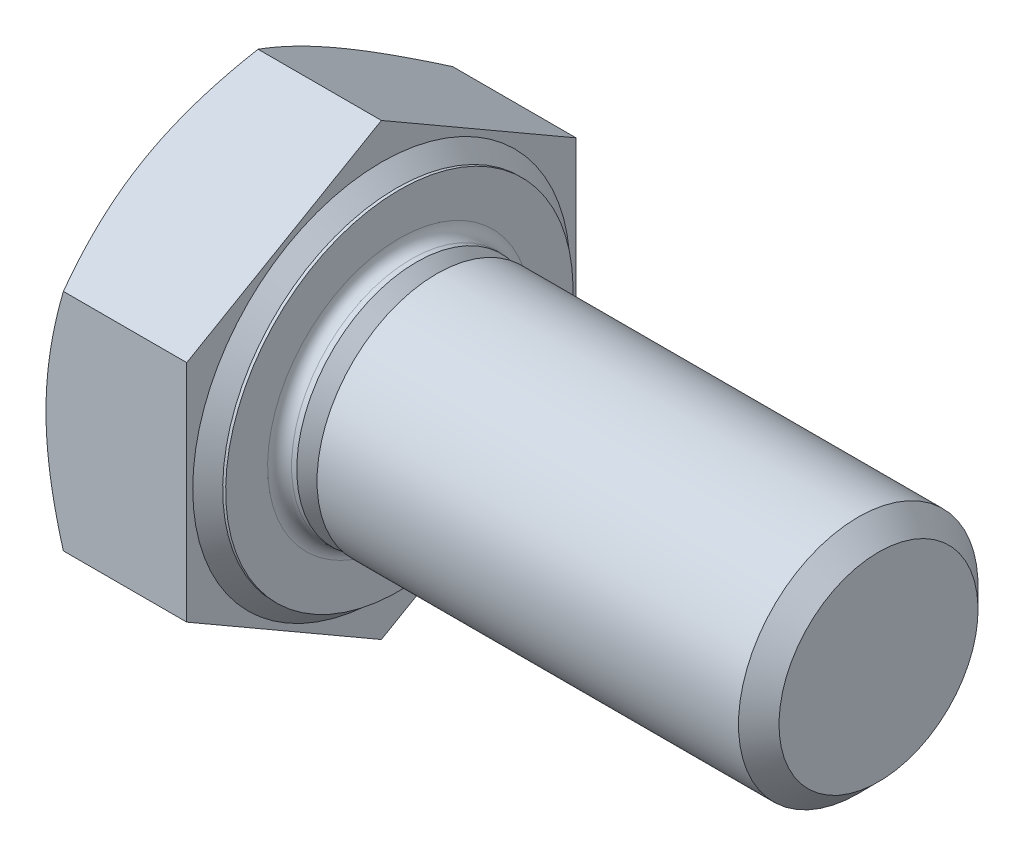
ISO-10303-21;
HEADER;
FILE_DESCRIPTION(('STEP AP214'),'2;1');
FILE_NAME('part.step','',(''),(''),'','','');
FILE_SCHEMA(('AUTOMOTIVE_DESIGN { 1 0 10303 214 1 1 1 1 }'));
ENDSEC;
DATA;
#1=APPLICATION_CONTEXT('core data for automotive mechanical design processes');
#2=APPLICATION_PROTOCOL_DEFINITION('international standard','automotive_design',2000,#1);
#3=PRODUCT_CONTEXT('',#1,'mechanical');
#4=PRODUCT('Part','Part','',(#3));
#5=PRODUCT_RELATED_PRODUCT_CATEGORY('part','',(#4));
#6=PRODUCT_DEFINITION_FORMATION('','',#4);
#7=PRODUCT_DEFINITION_CONTEXT('part definition',#1,'design');
#8=PRODUCT_DEFINITION('design','',#6,#7);
#9=PRODUCT_DEFINITION_SHAPE('','',#8);
#10=(LENGTH_UNIT() NAMED_UNIT(*) SI_UNIT(.MILLI.,.METRE.));
#11=(NAMED_UNIT(*) PLANE_ANGLE_UNIT() SI_UNIT($,.RADIAN.));
#12=(NAMED_UNIT(*) SI_UNIT($,.STERADIAN.) SOLID_ANGLE_UNIT());
#13=UNCERTAINTY_MEASURE_WITH_UNIT(LENGTH_MEASURE(1.E-05),#10,'distance_accuracy_value','');
#14=(GEOMETRIC_REPRESENTATION_CONTEXT(3) GLOBAL_UNCERTAINTY_ASSIGNED_CONTEXT((#13)) GLOBAL_UNIT_ASSIGNED_CONTEXT((#10,
#11,#12)) REPRESENTATION_CONTEXT('',''));
#15=CARTESIAN_POINT('',(0.,0.,0.));
#16=DIRECTION('',(0.,0.,1.));
#17=DIRECTION('',(1.,0.,0.));
#18=AXIS2_PLACEMENT_3D('',#15,#16,#17);
#19=CARTESIAN_POINT('',(0.,0.,0.));
#20=DIRECTION('',(-1.,0.,0.));
#21=DIRECTION('',(0.,0.,1.));
#22=AXIS2_PLACEMENT_3D('',#19,#20,#21);
#23=PLANE('',#22);
#24=DIRECTION('',(0.,-0.5,-0.866025403784439));
#25=VECTOR('',#24,1.);
#26=CARTESIAN_POINT('',(0.,7.50555349946513,0.));
#27=LINE('',#26,#25);
#28=CARTESIAN_POINT('',(0.,7.50555349946513,0.));
#29=VERTEX_POINT('',#28);
#30=CARTESIAN_POINT('',(0.,3.75277674973257,-6.5));
#31=VERTEX_POINT('',#30);
#32=EDGE_CURVE('E12',#29,#31,#27,.T.);
#33=ORIENTED_EDGE('',*,*,#32,.F.);
#34=DIRECTION('',(0.,0.5,-0.866025403784439));
#35=VECTOR('',#34,1.);
#36=CARTESIAN_POINT('',(0.,3.75277674973256,6.5));
#37=LINE('',#36,#35);
#38=CARTESIAN_POINT('',(0.,3.75277674973256,6.5));
#39=VERTEX_POINT('',#38);
#40=EDGE_CURVE('E213',#39,#29,#37,.T.);
#41=ORIENTED_EDGE('',*,*,#40,.F.);
#42=DIRECTION('',(0.,1.,0.));
#43=VECTOR('',#42,1.);
#44=CARTESIAN_POINT('',(0.,-3.75277674973257,6.5));
#45=LINE('',#44,#43);
#46=CARTESIAN_POINT('',(0.,-3.75277674973257,6.5));
#47=VERTEX_POINT('',#46);
#48=EDGE_CURVE('E29',#47,#39,#45,.T.);
#49=ORIENTED_EDGE('',*,*,#48,.F.);
#50=DIRECTION('',(0.,0.5,0.866025403784439));
#51=VECTOR('',#50,1.);
#52=CARTESIAN_POINT('',(0.,-7.50555349946513,0.));
#53=LINE('',#52,#51);
#54=CARTESIAN_POINT('',(0.,-7.50555349946513,0.));
#55=VERTEX_POINT('',#54);
#56=EDGE_CURVE('E299',#55,#47,#53,.T.);
#57=ORIENTED_EDGE('',*,*,#56,.F.);
#58=DIRECTION('',(0.,-0.5,0.866025403784439));
#59=VECTOR('',#58,1.);
#60=CARTESIAN_POINT('',(0.,-3.75277674973256,-6.5));
#61=LINE('',#60,#59);
#62=CARTESIAN_POINT('',(0.,-3.75277674973256,-6.5));
#63=VERTEX_POINT('',#62);
#64=EDGE_CURVE('E221',#63,#55,#61,.T.);
#65=ORIENTED_EDGE('',*,*,#64,.F.);
#66=DIRECTION('',(0.,-1.,0.));
#67=VECTOR('',#66,1.);
#68=CARTESIAN_POINT('',(0.,3.75277674973257,-6.5));
#69=LINE('',#68,#67);
#70=EDGE_CURVE('E286',#31,#63,#69,.T.);
#71=ORIENTED_EDGE('',*,*,#70,.F.);
#72=EDGE_LOOP('',(#33,#41,#49,#57,#65,#71));
#73=FACE_BOUND('',#72,.T.);
#74=CARTESIAN_POINT('',(0.,0.,0.));
#75=DIRECTION('',(-1.,0.,0.));
#76=DIRECTION('',(0.,1.,0.));
#77=AXIS2_PLACEMENT_3D('',#74,#75,#76);
#78=CIRCLE('',#77,6.3);
#79=CARTESIAN_POINT('',(0.,6.3,0.));
#80=VERTEX_POINT('',#79);
#81=EDGE_CURVE('E246',#80,#80,#78,.T.);
#82=ORIENTED_EDGE('',*,*,#81,.T.);
#83=EDGE_LOOP('',(#82));
#84=FACE_BOUND('',#83,.T.);
#85=ADVANCED_FACE('F18',(#73,#84),#23,.F.);
#86=CARTESIAN_POINT('',(-4.7,0.,0.));
#87=DIRECTION('',(-1.,0.,0.));
#88=DIRECTION('',(0.,0.,1.));
#89=AXIS2_PLACEMENT_3D('',#86,#87,#88);
#90=PLANE('',#89);
#91=CARTESIAN_POINT('',(-4.7,0.,0.));
#92=DIRECTION('',(1.,0.,0.));
#93=DIRECTION('',(0.,1.,0.));
#94=AXIS2_PLACEMENT_3D('',#91,#92,#93);
#95=CIRCLE('',#94,6.5);
#96=CARTESIAN_POINT('',(-4.7,-5.62916512459885,-3.25));
#97=VERTEX_POINT('',#96);
#98=CARTESIAN_POINT('',(-4.7,0.,-6.5));
#99=VERTEX_POINT('',#98);
#100=EDGE_CURVE('E200',#97,#99,#95,.T.);
#101=ORIENTED_EDGE('',*,*,#100,.F.);
#102=CARTESIAN_POINT('',(-4.7,0.,0.));
#103=DIRECTION('',(1.,0.,0.));
#104=DIRECTION('',(0.,1.,0.));
#105=AXIS2_PLACEMENT_3D('',#102,#103,#104);
#106=CIRCLE('',#105,6.5);
#107=CARTESIAN_POINT('',(-4.7,-5.62916512459885,3.25));
#108=VERTEX_POINT('',#107);
#109=EDGE_CURVE('E277',#108,#97,#106,.T.);
#110=ORIENTED_EDGE('',*,*,#109,.F.);
#111=CARTESIAN_POINT('',(-4.7,0.,0.));
#112=DIRECTION('',(1.,0.,0.));
#113=DIRECTION('',(0.,1.,0.));
#114=AXIS2_PLACEMENT_3D('',#111,#112,#113);
#115=CIRCLE('',#114,6.5);
#116=CARTESIAN_POINT('',(-4.7,0.,6.5));
#117=VERTEX_POINT('',#116);
#118=EDGE_CURVE('E165',#117,#108,#115,.T.);
#119=ORIENTED_EDGE('',*,*,#118,.F.);
#120=CARTESIAN_POINT('',(-4.7,0.,0.));
#121=DIRECTION('',(1.,0.,0.));
#122=DIRECTION('',(0.,1.,0.));
#123=AXIS2_PLACEMENT_3D('',#120,#121,#122);
#124=CIRCLE('',#123,6.5);
#125=CARTESIAN_POINT('',(-4.7,5.62916512459885,3.25));
#126=VERTEX_POINT('',#125);
#127=EDGE_CURVE('E105',#126,#117,#124,.T.);
#128=ORIENTED_EDGE('',*,*,#127,.F.);
#129=CARTESIAN_POINT('',(-4.7,0.,0.));
#130=DIRECTION('',(1.,0.,0.));
#131=DIRECTION('',(0.,1.,0.));
#132=AXIS2_PLACEMENT_3D('',#129,#130,#131);
#133=CIRCLE('',#132,6.5);
#134=CARTESIAN_POINT('',(-4.7,5.62916512459885,-3.25));
#135=VERTEX_POINT('',#134);
#136=EDGE_CURVE('E144',#135,#126,#133,.T.);
#137=ORIENTED_EDGE('',*,*,#136,.F.);
#138=CARTESIAN_POINT('',(-4.7,0.,0.));
#139=DIRECTION('',(1.,0.,0.));
#140=DIRECTION('',(0.,1.,0.));
#141=AXIS2_PLACEMENT_3D('',#138,#139,#140);
#142=CIRCLE('',#141,6.5);
#143=EDGE_CURVE('E212',#99,#135,#142,.T.);
#144=ORIENTED_EDGE('',*,*,#143,.F.);
#145=EDGE_LOOP('',(#101,#110,#119,#128,#137,#144));
#146=FACE_BOUND('',#145,.T.);
#147=ADVANCED_FACE('F163',(#146),#90,.T.);
#148=CARTESIAN_POINT('',(0.,5.62916512459885,-3.25));
#149=DIRECTION('',(0.,0.866025403784439,-0.5));
#150=DIRECTION('',(0.,-0.5,-0.866025403784439));
#151=AXIS2_PLACEMENT_3D('',#148,#149,#150);
#152=PLANE('',#151);
#153=CARTESIAN_POINT('',(-4.11831960379145,7.50749924357236,0.00337012765225198));
#154=CARTESIAN_POINT('',(-4.7,6.50078188514341,-1.74031548600823));
#155=CARTESIAN_POINT('',(-4.7,5.62916512459885,-3.25));
#156=CARTESIAN_POINT('',(-4.69999999999999,4.75754836405429,-4.75968451399176));
#157=CARTESIAN_POINT('',(-4.11831960379145,3.75083100562534,-6.50337012765225));
#158=(BOUNDED_CURVE() B_SPLINE_CURVE(2,(#153,#154,#155,#156,#157),.UNSPECIFIED.,.F.,
.F.) B_SPLINE_CURVE_WITH_KNOTS((3,2,3),(0.,3.81115565838423,7.62231131676846),
.UNSPECIFIED.) CURVE() GEOMETRIC_REPRESENTATION_ITEM() RATIONAL_B_SPLINE_CURVE((1.,
1.03802697460133,1.,1.03802697460134,1.)) REPRESENTATION_ITEM(''));
#159=CARTESIAN_POINT('',(-4.11944341639923,7.50555349946513,0.));
#160=VERTEX_POINT('',#159);
#161=EDGE_CURVE('E149',#160,#135,#158,.T.);
#162=ORIENTED_EDGE('',*,*,#161,.F.);
#163=DIRECTION('',(-1.,0.,0.));
#164=VECTOR('',#163,1.);
#165=CARTESIAN_POINT('',(0.,7.50555349946513,0.));
#166=LINE('',#165,#164);
#167=EDGE_CURVE('E159',#29,#160,#166,.T.);
#168=ORIENTED_EDGE('',*,*,#167,.F.);
#169=ORIENTED_EDGE('',*,*,#32,.T.);
#170=DIRECTION('',(-1.,0.,0.));
#171=VECTOR('',#170,1.);
#172=CARTESIAN_POINT('',(0.,3.75277674973257,-6.5));
#173=LINE('',#172,#171);
#174=CARTESIAN_POINT('',(-4.11944341639923,3.75277674973257,-6.5));
#175=VERTEX_POINT('',#174);
#176=EDGE_CURVE('E223',#31,#175,#173,.T.);
#177=ORIENTED_EDGE('',*,*,#176,.T.);
#178=CARTESIAN_POINT('',(-4.11831960379145,7.50749924357236,0.00337012765225198));
#179=CARTESIAN_POINT('',(-4.7,6.50078188514341,-1.74031548600823));
#180=CARTESIAN_POINT('',(-4.7,5.62916512459885,-3.25));
#181=CARTESIAN_POINT('',(-4.69999999999999,4.75754836405429,-4.75968451399176));
#182=CARTESIAN_POINT('',(-4.11831960379145,3.75083100562534,-6.50337012765225));
#183=(BOUNDED_CURVE() B_SPLINE_CURVE(2,(#178,#179,#180,#181,#182),.UNSPECIFIED.,.F.,
.F.) B_SPLINE_CURVE_WITH_KNOTS((3,2,3),(0.,3.81115565838423,7.62231131676846),
.UNSPECIFIED.) CURVE() GEOMETRIC_REPRESENTATION_ITEM() RATIONAL_B_SPLINE_CURVE((1.,
1.03802697460133,1.,1.03802697460134,1.)) REPRESENTATION_ITEM(''));
#184=EDGE_CURVE('E151',#135,#175,#183,.T.);
#185=ORIENTED_EDGE('',*,*,#184,.F.);
#186=EDGE_LOOP('',(#162,#168,#169,#177,#185));
#187=FACE_BOUND('',#186,.T.);
#188=ADVANCED_FACE('F344',(#187),#152,.T.);
#189=CARTESIAN_POINT('',(0.,0.,6.5));
#190=DIRECTION('',(0.,0.,1.));
#191=DIRECTION('',(0.,1.,0.));
#192=AXIS2_PLACEMENT_3D('',#189,#190,#191);
#193=PLANE('',#192);
#194=CARTESIAN_POINT('',(-4.11831960379145,-3.75666823794703,6.5));
#195=CARTESIAN_POINT('',(-4.7,-1.74323352108911,6.5));
#196=CARTESIAN_POINT('',(-4.7,0.,6.5));
#197=CARTESIAN_POINT('',(-4.70000000000001,1.74323352108911,6.5));
#198=CARTESIAN_POINT('',(-4.11831960379145,3.75666823794702,6.5));
#199=(BOUNDED_CURVE() B_SPLINE_CURVE(2,(#194,#195,#196,#197,#198),.UNSPECIFIED.,.F.,
.F.) B_SPLINE_CURVE_WITH_KNOTS((3,2,3),(0.,3.81115565838423,7.62231131676846),
.UNSPECIFIED.) CURVE() GEOMETRIC_REPRESENTATION_ITEM() RATIONAL_B_SPLINE_CURVE((1.,
1.03802697460134,1.,1.03802697460135,1.)) REPRESENTATION_ITEM(''));
#200=CARTESIAN_POINT('',(-4.11944341639923,-3.75277674973257,6.5));
#201=VERTEX_POINT('',#200);
#202=EDGE_CURVE('E177',#201,#117,#199,.T.);
#203=ORIENTED_EDGE('',*,*,#202,.F.);
#204=DIRECTION('',(-1.,0.,0.));
#205=VECTOR('',#204,1.);
#206=CARTESIAN_POINT('',(0.,-3.75277674973257,6.5));
#207=LINE('',#206,#205);
#208=EDGE_CURVE('E114',#47,#201,#207,.T.);
#209=ORIENTED_EDGE('',*,*,#208,.F.);
#210=ORIENTED_EDGE('',*,*,#48,.T.);
#211=DIRECTION('',(-1.,0.,0.));
#212=VECTOR('',#211,1.);
#213=CARTESIAN_POINT('',(0.,3.75277674973256,6.5));
#214=LINE('',#213,#212);
#215=CARTESIAN_POINT('',(-4.11944341639923,3.75277674973256,6.5));
#216=VERTEX_POINT('',#215);
#217=EDGE_CURVE('E217',#39,#216,#214,.T.);
#218=ORIENTED_EDGE('',*,*,#217,.T.);
#219=CARTESIAN_POINT('',(-4.11831960379145,-3.75666823794703,6.5));
#220=CARTESIAN_POINT('',(-4.7,-1.74323352108911,6.5));
#221=CARTESIAN_POINT('',(-4.7,0.,6.5));
#222=CARTESIAN_POINT('',(-4.70000000000001,1.74323352108911,6.5));
#223=CARTESIAN_POINT('',(-4.11831960379145,3.75666823794702,6.5));
#224=(BOUNDED_CURVE() B_SPLINE_CURVE(2,(#219,#220,#221,#222,#223),.UNSPECIFIED.,.F.,
.F.) B_SPLINE_CURVE_WITH_KNOTS((3,2,3),(0.,3.81115565838423,7.62231131676846),
.UNSPECIFIED.) CURVE() GEOMETRIC_REPRESENTATION_ITEM() RATIONAL_B_SPLINE_CURVE((1.,
1.03802697460134,1.,1.03802697460135,1.)) REPRESENTATION_ITEM(''));
#225=EDGE_CURVE('E169',#117,#216,#224,.T.);
#226=ORIENTED_EDGE('',*,*,#225,.F.);
#227=EDGE_LOOP('',(#203,#209,#210,#218,#226));
#228=FACE_BOUND('',#227,.T.);
#229=ADVANCED_FACE('F319',(#228),#193,.T.);
#230=CARTESIAN_POINT('',(0.,5.62916512459885,3.25));
#231=DIRECTION('',(0.,0.866025403784439,0.5));
#232=DIRECTION('',(0.,0.5,-0.866025403784439));
#233=AXIS2_PLACEMENT_3D('',#230,#231,#232);
#234=PLANE('',#233);
#235=CARTESIAN_POINT('',(-4.11831960379145,3.75083100562534,6.50337012765225));
#236=CARTESIAN_POINT('',(-4.7,4.7575483640543,4.75968451399176));
#237=CARTESIAN_POINT('',(-4.7,5.62916512459885,3.25));
#238=CARTESIAN_POINT('',(-4.7,6.5007818851434,1.74031548600824));
#239=CARTESIAN_POINT('',(-4.11831960379145,7.50749924357236,-0.00337012765224437));
#240=(BOUNDED_CURVE() B_SPLINE_CURVE(2,(#235,#236,#237,#238,#239),.UNSPECIFIED.,.F.,
.F.) B_SPLINE_CURVE_WITH_KNOTS((3,2,3),(0.,3.81115565838422,7.62231131676845),
.UNSPECIFIED.) CURVE() GEOMETRIC_REPRESENTATION_ITEM() RATIONAL_B_SPLINE_CURVE((1.,
1.03802697460134,1.,1.03802697460134,1.)) REPRESENTATION_ITEM(''));
#241=EDGE_CURVE('E157',#216,#126,#240,.T.);
#242=ORIENTED_EDGE('',*,*,#241,.F.);
#243=ORIENTED_EDGE('',*,*,#217,.F.);
#244=ORIENTED_EDGE('',*,*,#40,.T.);
#245=ORIENTED_EDGE('',*,*,#167,.T.);
#246=CARTESIAN_POINT('',(-4.11831960379145,3.75083100562534,6.50337012765225));
#247=CARTESIAN_POINT('',(-4.7,4.7575483640543,4.75968451399176));
#248=CARTESIAN_POINT('',(-4.7,5.62916512459885,3.25));
#249=CARTESIAN_POINT('',(-4.7,6.5007818851434,1.74031548600824));
#250=CARTESIAN_POINT('',(-4.11831960379145,7.50749924357236,-0.00337012765224437));
#251=(BOUNDED_CURVE() B_SPLINE_CURVE(2,(#246,#247,#248,#249,#250),.UNSPECIFIED.,.F.,
.F.) B_SPLINE_CURVE_WITH_KNOTS((3,2,3),(0.,3.81115565838422,7.62231131676845),
.UNSPECIFIED.) CURVE() GEOMETRIC_REPRESENTATION_ITEM() RATIONAL_B_SPLINE_CURVE((1.,
1.03802697460134,1.,1.03802697460134,1.)) REPRESENTATION_ITEM(''));
#252=EDGE_CURVE('E147',#126,#160,#251,.T.);
#253=ORIENTED_EDGE('',*,*,#252,.F.);
#254=EDGE_LOOP('',(#242,#243,#244,#245,#253));
#255=FACE_BOUND('',#254,.T.);
#256=ADVANCED_FACE('F155',(#255),#234,.T.);
#257=CARTESIAN_POINT('',(0.,0.,-6.5));
#258=DIRECTION('',(0.,0.,-1.));
#259=DIRECTION('',(0.,-1.,0.));
#260=AXIS2_PLACEMENT_3D('',#257,#258,#259);
#261=PLANE('',#260);
#262=CARTESIAN_POINT('',(-4.11831960379145,3.75666823794702,-6.5));
#263=CARTESIAN_POINT('',(-4.7,1.74323352108911,-6.5));
#264=CARTESIAN_POINT('',(-4.7,0.,-6.5));
#265=CARTESIAN_POINT('',(-4.7,-1.74323352108911,-6.5));
#266=CARTESIAN_POINT('',(-4.11831960379145,-3.75666823794702,-6.5));
#267=(BOUNDED_CURVE() B_SPLINE_CURVE(2,(#262,#263,#264,#265,#266),.UNSPECIFIED.,.F.,
.F.) B_SPLINE_CURVE_WITH_KNOTS((3,2,3),(0.,3.81115565838423,7.62231131676846),
.UNSPECIFIED.) CURVE() GEOMETRIC_REPRESENTATION_ITEM() RATIONAL_B_SPLINE_CURVE((1.,
1.03802697460133,1.,1.03802697460133,1.)) REPRESENTATION_ITEM(''));
#268=CARTESIAN_POINT('',(-4.11944341639923,-3.75277674973256,-6.5));
#269=VERTEX_POINT('',#268);
#270=EDGE_CURVE('E193',#99,#269,#267,.T.);
#271=ORIENTED_EDGE('',*,*,#270,.F.);
#272=CARTESIAN_POINT('',(-4.11831960379145,3.75666823794702,-6.5));
#273=CARTESIAN_POINT('',(-4.7,1.74323352108911,-6.5));
#274=CARTESIAN_POINT('',(-4.7,0.,-6.5));
#275=CARTESIAN_POINT('',(-4.7,-1.74323352108911,-6.5));
#276=CARTESIAN_POINT('',(-4.11831960379145,-3.75666823794702,-6.5));
#277=(BOUNDED_CURVE() B_SPLINE_CURVE(2,(#272,#273,#274,#275,#276),.UNSPECIFIED.,.F.,
.F.) B_SPLINE_CURVE_WITH_KNOTS((3,2,3),(0.,3.81115565838423,7.62231131676846),
.UNSPECIFIED.) CURVE() GEOMETRIC_REPRESENTATION_ITEM() RATIONAL_B_SPLINE_CURVE((1.,
1.03802697460133,1.,1.03802697460133,1.)) REPRESENTATION_ITEM(''));
#278=EDGE_CURVE('E204',#175,#99,#277,.T.);
#279=ORIENTED_EDGE('',*,*,#278,.F.);
#280=ORIENTED_EDGE('',*,*,#176,.F.);
#281=ORIENTED_EDGE('',*,*,#70,.T.);
#282=DIRECTION('',(-1.,0.,0.));
#283=VECTOR('',#282,1.);
#284=CARTESIAN_POINT('',(0.,-3.75277674973256,-6.5));
#285=LINE('',#284,#283);
#286=EDGE_CURVE('E84',#63,#269,#285,.T.);
#287=ORIENTED_EDGE('',*,*,#286,.T.);
#288=EDGE_LOOP('',(#271,#279,#280,#281,#287));
#289=FACE_BOUND('',#288,.T.);
#290=ADVANCED_FACE('F364',(#289),#261,.T.);
#291=CARTESIAN_POINT('',(0.,-5.62916512459885,-3.25));
#292=DIRECTION('',(0.,-0.866025403784439,-0.5));
#293=DIRECTION('',(0.,-0.5,0.866025403784439));
#294=AXIS2_PLACEMENT_3D('',#291,#292,#293);
#295=PLANE('',#294);
#296=CARTESIAN_POINT('',(-4.11831960379145,-3.75083100562533,-6.50337012765225));
#297=CARTESIAN_POINT('',(-4.7,-4.75754836405429,-4.75968451399176));
#298=CARTESIAN_POINT('',(-4.7,-5.62916512459885,-3.25));
#299=CARTESIAN_POINT('',(-4.70000000000001,-6.50078188514341,-1.74031548600824));
#300=CARTESIAN_POINT('',(-4.11831960379145,-7.50749924357236,0.00337012765224532));
#301=(BOUNDED_CURVE() B_SPLINE_CURVE(2,(#296,#297,#298,#299,#300),.UNSPECIFIED.,.F.,
.F.) B_SPLINE_CURVE_WITH_KNOTS((3,2,3),(0.,3.81115565838423,7.62231131676846),
.UNSPECIFIED.) CURVE() GEOMETRIC_REPRESENTATION_ITEM() RATIONAL_B_SPLINE_CURVE((1.,
1.03802697460135,1.,1.03802697460131,1.)) REPRESENTATION_ITEM(''));
#302=CARTESIAN_POINT('',(-4.11944341639923,-7.50555349946513,0.));
#303=VERTEX_POINT('',#302);
#304=EDGE_CURVE('E91',#97,#303,#301,.T.);
#305=ORIENTED_EDGE('',*,*,#304,.F.);
#306=CARTESIAN_POINT('',(-4.11831960379145,-3.75083100562533,-6.50337012765225));
#307=CARTESIAN_POINT('',(-4.7,-4.75754836405429,-4.75968451399176));
#308=CARTESIAN_POINT('',(-4.7,-5.62916512459885,-3.25));
#309=CARTESIAN_POINT('',(-4.70000000000001,-6.50078188514341,-1.74031548600824));
#310=CARTESIAN_POINT('',(-4.11831960379145,-7.50749924357236,0.00337012765224532));
#311=(BOUNDED_CURVE() B_SPLINE_CURVE(2,(#306,#307,#308,#309,#310),.UNSPECIFIED.,.F.,
.F.) B_SPLINE_CURVE_WITH_KNOTS((3,2,3),(0.,3.81115565838423,7.62231131676846),
.UNSPECIFIED.) CURVE() GEOMETRIC_REPRESENTATION_ITEM() RATIONAL_B_SPLINE_CURVE((1.,
1.03802697460135,1.,1.03802697460131,1.)) REPRESENTATION_ITEM(''));
#312=EDGE_CURVE('E240',#269,#97,#311,.T.);
#313=ORIENTED_EDGE('',*,*,#312,.F.);
#314=ORIENTED_EDGE('',*,*,#286,.F.);
#315=ORIENTED_EDGE('',*,*,#64,.T.);
#316=DIRECTION('',(-1.,0.,0.));
#317=VECTOR('',#316,1.);
#318=CARTESIAN_POINT('',(0.,-7.50555349946513,0.));
#319=LINE('',#318,#317);
#320=EDGE_CURVE('E298',#55,#303,#319,.T.);
#321=ORIENTED_EDGE('',*,*,#320,.T.);
#322=EDGE_LOOP('',(#305,#313,#314,#315,#321));
#323=FACE_BOUND('',#322,.T.);
#324=ADVANCED_FACE('F325',(#323),#295,.T.);
#325=CARTESIAN_POINT('',(0.,-5.62916512459885,3.25));
#326=DIRECTION('',(0.,-0.866025403784439,0.5));
#327=DIRECTION('',(0.,0.5,0.866025403784439));
#328=AXIS2_PLACEMENT_3D('',#325,#326,#327);
#329=PLANE('',#328);
#330=CARTESIAN_POINT('',(-4.11831960379145,-7.50749924357236,-0.00337012765224961));
#331=CARTESIAN_POINT('',(-4.7,-6.50078188514341,1.74031548600824));
#332=CARTESIAN_POINT('',(-4.7,-5.62916512459885,3.25));
#333=CARTESIAN_POINT('',(-4.70000000000001,-4.75754836405431,4.75968451399176));
#334=CARTESIAN_POINT('',(-4.11831960379145,-3.75083100562534,6.50337012765225));
#335=(BOUNDED_CURVE() B_SPLINE_CURVE(2,(#330,#331,#332,#333,#334),.UNSPECIFIED.,.F.,
.F.) B_SPLINE_CURVE_WITH_KNOTS((3,2,3),(0.,3.81115565838423,7.62231131676845),
.UNSPECIFIED.) CURVE() GEOMETRIC_REPRESENTATION_ITEM() RATIONAL_B_SPLINE_CURVE((1.,
1.03802697460132,1.,1.03802697460133,1.)) REPRESENTATION_ITEM(''));
#336=EDGE_CURVE('E118',#108,#201,#335,.T.);
#337=ORIENTED_EDGE('',*,*,#336,.F.);
#338=CARTESIAN_POINT('',(-4.11831960379145,-7.50749924357236,-0.00337012765224961));
#339=CARTESIAN_POINT('',(-4.7,-6.50078188514341,1.74031548600824));
#340=CARTESIAN_POINT('',(-4.7,-5.62916512459885,3.25));
#341=CARTESIAN_POINT('',(-4.70000000000001,-4.75754836405431,4.75968451399176));
#342=CARTESIAN_POINT('',(-4.11831960379145,-3.75083100562534,6.50337012765225));
#343=(BOUNDED_CURVE() B_SPLINE_CURVE(2,(#338,#339,#340,#341,#342),.UNSPECIFIED.,.F.,
.F.) B_SPLINE_CURVE_WITH_KNOTS((3,2,3),(0.,3.81115565838423,7.62231131676845),
.UNSPECIFIED.) CURVE() GEOMETRIC_REPRESENTATION_ITEM() RATIONAL_B_SPLINE_CURVE((1.,
1.03802697460132,1.,1.03802697460133,1.)) REPRESENTATION_ITEM(''));
#344=EDGE_CURVE('E199',#303,#108,#343,.T.);
#345=ORIENTED_EDGE('',*,*,#344,.F.);
#346=ORIENTED_EDGE('',*,*,#320,.F.);
#347=ORIENTED_EDGE('',*,*,#56,.T.);
#348=ORIENTED_EDGE('',*,*,#208,.T.);
#349=EDGE_LOOP('',(#337,#345,#346,#347,#348));
#350=FACE_BOUND('',#349,.T.);
#351=ADVANCED_FACE('F324',(#350),#329,.T.);
#352=CARTESIAN_POINT('',(-4.40915980189572,0.,0.));
#353=DIRECTION('',(1.,0.,0.));
#354=DIRECTION('',(0.,1.,0.));
#355=AXIS2_PLACEMENT_3D('',#352,#353,#354);
#356=CONICAL_SURFACE('',#355,7.00375,1.0471975511966);
#357=ORIENTED_EDGE('',*,*,#184,.T.);
#358=ORIENTED_EDGE('',*,*,#278,.T.);
#359=ORIENTED_EDGE('',*,*,#143,.T.);
#360=EDGE_LOOP('',(#357,#358,#359));
#361=FACE_BOUND('',#360,.T.);
#362=ADVANCED_FACE('F375',(#361),#356,.T.);
#363=CARTESIAN_POINT('',(-4.40915980189572,0.,0.));
#364=DIRECTION('',(1.,0.,0.));
#365=DIRECTION('',(0.,1.,0.));
#366=AXIS2_PLACEMENT_3D('',#363,#364,#365);
#367=CONICAL_SURFACE('',#366,7.00375,1.0471975511966);
#368=ORIENTED_EDGE('',*,*,#252,.T.);
#369=ORIENTED_EDGE('',*,*,#161,.T.);
#370=ORIENTED_EDGE('',*,*,#136,.T.);
#371=EDGE_LOOP('',(#368,#369,#370));
#372=FACE_BOUND('',#371,.T.);
#373=ADVANCED_FACE('F146',(#372),#367,.T.);
#374=CARTESIAN_POINT('',(-4.40915980189572,0.,0.));
#375=DIRECTION('',(1.,0.,0.));
#376=DIRECTION('',(0.,1.,0.));
#377=AXIS2_PLACEMENT_3D('',#374,#375,#376);
#378=CONICAL_SURFACE('',#377,7.00375,1.0471975511966);
#379=ORIENTED_EDGE('',*,*,#225,.T.);
#380=ORIENTED_EDGE('',*,*,#241,.T.);
#381=ORIENTED_EDGE('',*,*,#127,.T.);
#382=EDGE_LOOP('',(#379,#380,#381));
#383=FACE_BOUND('',#382,.T.);
#384=ADVANCED_FACE('F168',(#383),#378,.T.);
#385=CARTESIAN_POINT('',(-4.40915980189572,0.,0.));
#386=DIRECTION('',(1.,0.,0.));
#387=DIRECTION('',(0.,1.,0.));
#388=AXIS2_PLACEMENT_3D('',#385,#386,#387);
#389=CONICAL_SURFACE('',#388,7.00375,1.0471975511966);
#390=ORIENTED_EDGE('',*,*,#202,.T.);
#391=ORIENTED_EDGE('',*,*,#118,.T.);
#392=ORIENTED_EDGE('',*,*,#336,.T.);
#393=EDGE_LOOP('',(#390,#391,#392));
#394=FACE_BOUND('',#393,.T.);
#395=ADVANCED_FACE('F317',(#394),#389,.T.);
#396=CARTESIAN_POINT('',(-4.40915980189572,0.,0.));
#397=DIRECTION('',(1.,0.,0.));
#398=DIRECTION('',(0.,1.,0.));
#399=AXIS2_PLACEMENT_3D('',#396,#397,#398);
#400=CONICAL_SURFACE('',#399,7.00375,1.0471975511966);
#401=ORIENTED_EDGE('',*,*,#344,.T.);
#402=ORIENTED_EDGE('',*,*,#109,.T.);
#403=ORIENTED_EDGE('',*,*,#304,.T.);
#404=EDGE_LOOP('',(#401,#402,#403));
#405=FACE_BOUND('',#404,.T.);
#406=ADVANCED_FACE('F326',(#405),#400,.T.);
#407=CARTESIAN_POINT('',(-4.40915980189572,0.,0.));
#408=DIRECTION('',(1.,0.,0.));
#409=DIRECTION('',(0.,1.,0.));
#410=AXIS2_PLACEMENT_3D('',#407,#408,#409);
#411=CONICAL_SURFACE('',#410,7.00375,1.0471975511966);
#412=ORIENTED_EDGE('',*,*,#312,.T.);
#413=ORIENTED_EDGE('',*,*,#100,.T.);
#414=ORIENTED_EDGE('',*,*,#270,.T.);
#415=EDGE_LOOP('',(#412,#413,#414));
#416=FACE_BOUND('',#415,.T.);
#417=ADVANCED_FACE('F328',(#416),#411,.T.);
#418=CARTESIAN_POINT('',(16.6,1.66171875,0.));
#419=DIRECTION('',(1.,0.,0.));
#420=DIRECTION('',(0.,1.,0.));
#421=AXIS2_PLACEMENT_3D('',#418,#419,#420);
#422=PLANE('',#421);
#423=CARTESIAN_POINT('',(16.6,0.,0.));
#424=DIRECTION('',(1.,0.,0.));
#425=DIRECTION('',(0.,1.,0.));
#426=AXIS2_PLACEMENT_3D('',#423,#424,#425);
#427=CIRCLE('',#426,3.3234375);
#428=CARTESIAN_POINT('',(16.6,3.3234375,0.));
#429=VERTEX_POINT('',#428);
#430=EDGE_CURVE('E305',#429,#429,#427,.T.);
#431=ORIENTED_EDGE('',*,*,#430,.T.);
#432=EDGE_LOOP('',(#431));
#433=FACE_BOUND('',#432,.T.);
#434=ADVANCED_FACE('F20',(#433),#422,.T.);
#435=CARTESIAN_POINT('',(16.26171875,0.,0.));
#436=DIRECTION('',(-1.,0.,0.));
#437=DIRECTION('',(0.,1.,0.));
#438=AXIS2_PLACEMENT_3D('',#435,#436,#437);
#439=CONICAL_SURFACE('',#438,3.66171875,0.785398163397449);
#440=CARTESIAN_POINT('',(15.9234375,0.,0.));
#441=DIRECTION('',(1.,0.,0.));
#442=DIRECTION('',(0.,1.,0.));
#443=AXIS2_PLACEMENT_3D('',#440,#441,#442);
#444=CIRCLE('',#443,4.);
#445=CARTESIAN_POINT('',(15.9234375,4.,0.));
#446=VERTEX_POINT('',#445);
#447=EDGE_CURVE('E228',#446,#446,#444,.T.);
#448=ORIENTED_EDGE('',*,*,#447,.T.);
#449=EDGE_LOOP('',(#448));
#450=FACE_BOUND('',#449,.T.);
#451=ORIENTED_EDGE('',*,*,#430,.F.);
#452=EDGE_LOOP('',(#451));
#453=FACE_BOUND('',#452,.T.);
#454=ADVANCED_FACE('F360',(#450,#453),#439,.T.);
#455=CARTESIAN_POINT('',(8.88671875,0.,0.));
#456=DIRECTION('',(-1.,0.,0.));
#457=DIRECTION('',(0.,1.,0.));
#458=AXIS2_PLACEMENT_3D('',#455,#456,#457);
#459=CYLINDRICAL_SURFACE('',#458,4.);
#460=CARTESIAN_POINT('',(1.85,0.,0.));
#461=DIRECTION('',(1.,0.,0.));
#462=DIRECTION('',(0.,1.,0.));
#463=AXIS2_PLACEMENT_3D('',#460,#461,#462);
#464=CIRCLE('',#463,4.);
#465=CARTESIAN_POINT('',(1.85,4.,0.));
#466=VERTEX_POINT('',#465);
#467=EDGE_CURVE('E296',#466,#466,#464,.T.);
#468=ORIENTED_EDGE('',*,*,#467,.T.);
#469=EDGE_LOOP('',(#468));
#470=FACE_BOUND('',#469,.T.);
#471=ORIENTED_EDGE('',*,*,#447,.F.);
#472=EDGE_LOOP('',(#471));
#473=FACE_BOUND('',#472,.T.);
#474=ADVANCED_FACE('F357',(#470,#473),#459,.T.);
#475=CARTESIAN_POINT('',(1.85,3.66171875,0.));
#476=DIRECTION('',(-1.,0.,0.));
#477=DIRECTION('',(0.,-1.,0.));
#478=AXIS2_PLACEMENT_3D('',#475,#476,#477);
#479=PLANE('',#478);
#480=CARTESIAN_POINT('',(1.85,0.,0.));
#481=DIRECTION('',(1.,0.,0.));
#482=DIRECTION('',(0.,1.,0.));
#483=AXIS2_PLACEMENT_3D('',#480,#481,#482);
#484=CIRCLE('',#483,3.3234375);
#485=CARTESIAN_POINT('',(1.85,3.3234375,0.));
#486=VERTEX_POINT('',#485);
#487=EDGE_CURVE('E130',#486,#486,#484,.T.);
#488=ORIENTED_EDGE('',*,*,#487,.T.);
#489=EDGE_LOOP('',(#488));
#490=FACE_BOUND('',#489,.T.);
#491=ORIENTED_EDGE('',*,*,#467,.F.);
#492=EDGE_LOOP('',(#491));
#493=FACE_BOUND('',#492,.T.);
#494=ADVANCED_FACE('F354',(#490,#493),#479,.T.);
#495=CARTESIAN_POINT('',(1.51171875,0.,0.));
#496=DIRECTION('',(-1.,0.,0.));
#497=DIRECTION('',(0.,1.,0.));
#498=AXIS2_PLACEMENT_3D('',#495,#496,#497);
#499=CONICAL_SURFACE('',#498,3.66171875,0.785398163397448);
#500=CARTESIAN_POINT('',(1.1734375,0.,0.));
#501=DIRECTION('',(1.,0.,0.));
#502=DIRECTION('',(0.,1.,0.));
#503=AXIS2_PLACEMENT_3D('',#500,#501,#502);
#504=CIRCLE('',#503,4.);
#505=CARTESIAN_POINT('',(1.1734375,4.,0.));
#506=VERTEX_POINT('',#505);
#507=EDGE_CURVE('E135',#506,#506,#504,.T.);
#508=ORIENTED_EDGE('',*,*,#507,.T.);
#509=EDGE_LOOP('',(#508));
#510=FACE_BOUND('',#509,.T.);
#511=ORIENTED_EDGE('',*,*,#487,.F.);
#512=EDGE_LOOP('',(#511));
#513=FACE_BOUND('',#512,.T.);
#514=ADVANCED_FACE('F352',(#510,#513),#499,.T.);
#515=CARTESIAN_POINT('',(0.11671875,0.,0.));
#516=DIRECTION('',(-1.,0.,0.));
#517=DIRECTION('',(0.,1.,0.));
#518=AXIS2_PLACEMENT_3D('',#515,#516,#517);
#519=CYLINDRICAL_SURFACE('',#518,4.);
#520=ORIENTED_EDGE('',*,*,#507,.F.);
#521=EDGE_LOOP('',(#520));
#522=FACE_BOUND('',#521,.T.);
#523=CARTESIAN_POINT('',(1.,0.,0.));
#524=DIRECTION('',(1.,0.,0.));
#525=DIRECTION('',(0.,1.,0.));
#526=AXIS2_PLACEMENT_3D('',#523,#524,#525);
#527=CIRCLE('',#526,4.);
#528=CARTESIAN_POINT('',(1.,4.,0.));
#529=VERTEX_POINT('',#528);
#530=EDGE_CURVE('E22',#529,#529,#527,.T.);
#531=ORIENTED_EDGE('',*,*,#530,.T.);
#532=EDGE_LOOP('',(#531));
#533=FACE_BOUND('',#532,.T.);
#534=ADVANCED_FACE('F348',(#522,#533),#519,.T.);
#535=CARTESIAN_POINT('',(1.,0.,0.));
#536=DIRECTION('',(1.,0.,0.));
#537=DIRECTION('',(0.,0.,-1.));
#538=AXIS2_PLACEMENT_3D('',#535,#536,#537);
#539=TOROIDAL_SURFACE('',#538,4.4,0.4);
#540=CARTESIAN_POINT('',(0.6,0.,0.));
#541=DIRECTION('',(1.,0.,0.));
#542=DIRECTION('',(0.,1.,0.));
#543=AXIS2_PLACEMENT_3D('',#540,#541,#542);
#544=CIRCLE('',#543,4.4);
#545=CARTESIAN_POINT('',(0.6,4.4,0.));
#546=VERTEX_POINT('',#545);
#547=EDGE_CURVE('E245',#546,#546,#544,.T.);
#548=ORIENTED_EDGE('',*,*,#547,.T.);
#549=EDGE_LOOP('',(#548));
#550=FACE_BOUND('',#549,.T.);
#551=ORIENTED_EDGE('',*,*,#530,.F.);
#552=EDGE_LOOP('',(#551));
#553=FACE_BOUND('',#552,.T.);
#554=ADVANCED_FACE('F351',(#550,#553),#539,.F.);
#555=CARTESIAN_POINT('',(0.6,5.1,0.));
#556=DIRECTION('',(1.,0.,0.));
#557=DIRECTION('',(0.,1.,0.));
#558=AXIS2_PLACEMENT_3D('',#555,#556,#557);
#559=PLANE('',#558);
#560=CARTESIAN_POINT('',(0.6,0.,0.));
#561=DIRECTION('',(1.,0.,0.));
#562=DIRECTION('',(0.,1.,0.));
#563=AXIS2_PLACEMENT_3D('',#560,#561,#562);
#564=CIRCLE('',#563,5.8);
#565=CARTESIAN_POINT('',(0.6,5.8,0.));
#566=VERTEX_POINT('',#565);
#567=EDGE_CURVE('E241',#566,#566,#564,.T.);
#568=ORIENTED_EDGE('',*,*,#567,.T.);
#569=EDGE_LOOP('',(#568));
#570=FACE_BOUND('',#569,.T.);
#571=ORIENTED_EDGE('',*,*,#547,.F.);
#572=EDGE_LOOP('',(#571));
#573=FACE_BOUND('',#572,.T.);
#574=ADVANCED_FACE('F372',(#570,#573),#559,.T.);
#575=CARTESIAN_POINT('',(0.55,0.,0.));
#576=DIRECTION('',(-1.,0.,0.));
#577=DIRECTION('',(0.,1.,0.));
#578=AXIS2_PLACEMENT_3D('',#575,#576,#577);
#579=CYLINDRICAL_SURFACE('',#578,5.8);
#580=CARTESIAN_POINT('',(0.5,0.,0.));
#581=DIRECTION('',(1.,0.,0.));
#582=DIRECTION('',(0.,1.,0.));
#583=AXIS2_PLACEMENT_3D('',#580,#581,#582);
#584=CIRCLE('',#583,5.8);
#585=CARTESIAN_POINT('',(0.5,5.8,0.));
#586=VERTEX_POINT('',#585);
#587=EDGE_CURVE('E201',#586,#586,#584,.T.);
#588=ORIENTED_EDGE('',*,*,#587,.T.);
#589=EDGE_LOOP('',(#588));
#590=FACE_BOUND('',#589,.T.);
#591=ORIENTED_EDGE('',*,*,#567,.F.);
#592=EDGE_LOOP('',(#591));
#593=FACE_BOUND('',#592,.T.);
#594=ADVANCED_FACE('F368',(#590,#593),#579,.T.);
#595=CARTESIAN_POINT('',(0.25,0.,0.));
#596=DIRECTION('',(-1.,0.,0.));
#597=DIRECTION('',(0.,1.,0.));
#598=AXIS2_PLACEMENT_3D('',#595,#596,#597);
#599=CONICAL_SURFACE('',#598,6.05,0.785398163397448);
#600=ORIENTED_EDGE('',*,*,#81,.F.);
#601=EDGE_LOOP('',(#600));
#602=FACE_BOUND('',#601,.T.);
#603=ORIENTED_EDGE('',*,*,#587,.F.);
#604=EDGE_LOOP('',(#603));
#605=FACE_BOUND('',#604,.T.);
#606=ADVANCED_FACE('F365',(#602,#605),#599,.T.);
#607=CLOSED_SHELL('',(#85,#147,#188,#229,#256,#290,#324,#351,#362,#373,#384,#395,#406,#417,#434,
#454,#474,#494,#514,#534,#554,#574,#594,#606));
#608=MANIFOLD_SOLID_BREP('B1',#607);
#609=ADVANCED_BREP_SHAPE_REPRESENTATION('',(#18,#608),#14);
#610=SHAPE_DEFINITION_REPRESENTATION(#9,#609);
ENDSEC;
END-ISO-10303-21;
